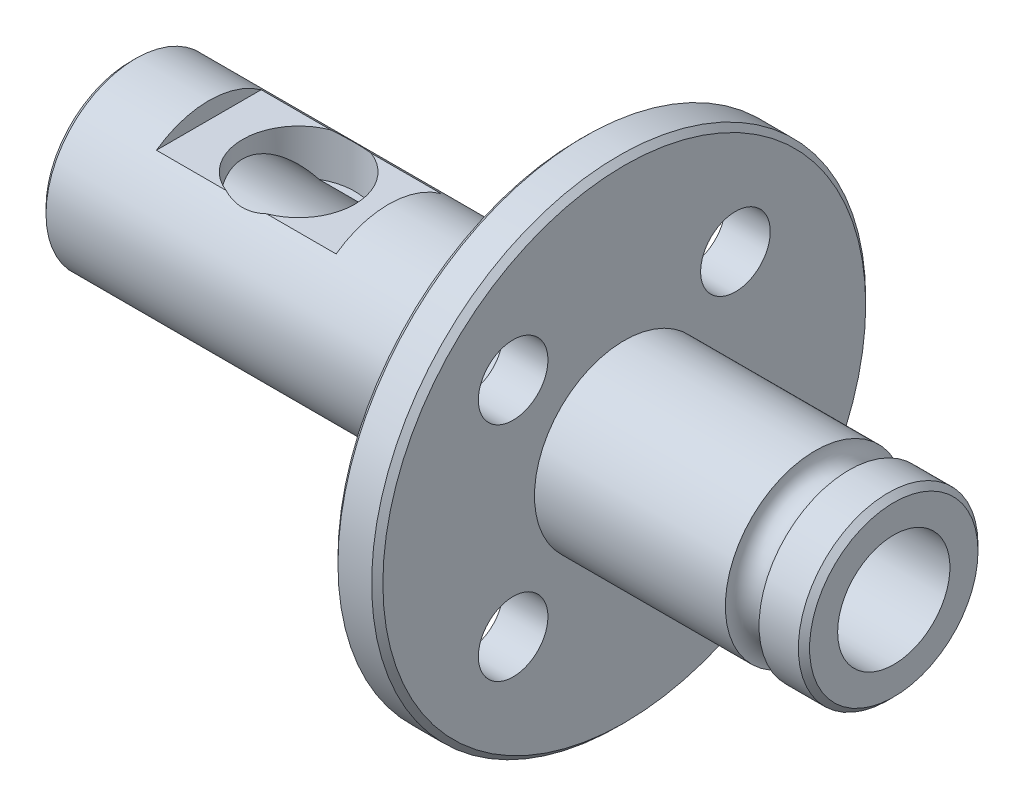
ISO-10303-21;
HEADER;
FILE_DESCRIPTION(('STEP AP214'),'2;1');
FILE_NAME('part.step','',(''),(''),'','','');
FILE_SCHEMA(('AUTOMOTIVE_DESIGN { 1 0 10303 214 1 1 1 1 }'));
ENDSEC;
DATA;
#1=APPLICATION_CONTEXT('core data for automotive mechanical design processes');
#2=APPLICATION_PROTOCOL_DEFINITION('international standard','automotive_design',2000,#1);
#3=PRODUCT_CONTEXT('',#1,'mechanical');
#4=PRODUCT('Part','Part','',(#3));
#5=PRODUCT_RELATED_PRODUCT_CATEGORY('part','',(#4));
#6=PRODUCT_DEFINITION_FORMATION('','',#4);
#7=PRODUCT_DEFINITION_CONTEXT('part definition',#1,'design');
#8=PRODUCT_DEFINITION('design','',#6,#7);
#9=PRODUCT_DEFINITION_SHAPE('','',#8);
#10=(LENGTH_UNIT() NAMED_UNIT(*) SI_UNIT(.MILLI.,.METRE.));
#11=(NAMED_UNIT(*) PLANE_ANGLE_UNIT() SI_UNIT($,.RADIAN.));
#12=(NAMED_UNIT(*) SI_UNIT($,.STERADIAN.) SOLID_ANGLE_UNIT());
#13=UNCERTAINTY_MEASURE_WITH_UNIT(LENGTH_MEASURE(1.E-05),#10,'distance_accuracy_value','');
#14=(GEOMETRIC_REPRESENTATION_CONTEXT(3) GLOBAL_UNCERTAINTY_ASSIGNED_CONTEXT((#13)) GLOBAL_UNIT_ASSIGNED_CONTEXT((#10,
#11,#12)) REPRESENTATION_CONTEXT('',''));
#15=CARTESIAN_POINT('',(0.,0.,0.));
#16=DIRECTION('',(0.,0.,1.));
#17=DIRECTION('',(1.,0.,0.));
#18=AXIS2_PLACEMENT_3D('',#15,#16,#17);
#19=CARTESIAN_POINT('',(34.,0.,0.));
#20=DIRECTION('',(-1.,0.,0.));
#21=DIRECTION('',(0.,0.,1.));
#22=AXIS2_PLACEMENT_3D('',#19,#20,#21);
#23=CYLINDRICAL_SURFACE('',#22,2.5);
#24=CARTESIAN_POINT('',(0.,0.,0.));
#25=DIRECTION('',(-1.,0.,0.));
#26=DIRECTION('',(0.,0.,1.));
#27=AXIS2_PLACEMENT_3D('',#24,#25,#26);
#28=CIRCLE('',#27,2.5);
#29=CARTESIAN_POINT('',(0.,0.,2.5));
#30=VERTEX_POINT('',#29);
#31=EDGE_CURVE('E177',#30,#30,#28,.T.);
#32=ORIENTED_EDGE('',*,*,#31,.T.);
#33=EDGE_LOOP('',(#32));
#34=FACE_BOUND('',#33,.T.);
#35=CARTESIAN_POINT('',(34.,0.,0.));
#36=DIRECTION('',(-1.,0.,0.));
#37=DIRECTION('',(0.,0.,1.));
#38=AXIS2_PLACEMENT_3D('',#35,#36,#37);
#39=CIRCLE('',#38,2.5);
#40=CARTESIAN_POINT('',(34.,0.,2.5));
#41=VERTEX_POINT('',#40);
#42=EDGE_CURVE('E178',#41,#41,#39,.T.);
#43=ORIENTED_EDGE('',*,*,#42,.F.);
#44=EDGE_LOOP('',(#43));
#45=FACE_BOUND('',#44,.T.);
#46=DIRECTION('',(-1.,0.,0.));
#47=VECTOR('',#46,1.);
#48=CARTESIAN_POINT('',(34.,1.25,-2.1650635094611));
#49=LINE('',#48,#47);
#50=CARTESIAN_POINT('',(6.25,1.25,-2.1650635094611));
#51=VERTEX_POINT('',#50);
#52=CARTESIAN_POINT('',(8.75,1.25,-2.1650635094611));
#53=VERTEX_POINT('',#52);
#54=EDGE_CURVE('E90',#51,#53,#49,.F.);
#55=ORIENTED_EDGE('',*,*,#54,.F.);
#56=CARTESIAN_POINT('',(7.5,0.,0.));
#57=DIRECTION('',(-0.707106781186547,-0.707106781186547,0.));
#58=DIRECTION('',(-0.707106781186547,0.707106781186547,0.));
#59=AXIS2_PLACEMENT_3D('',#56,#57,#58);
#60=ELLIPSE('',#59,3.53553390593274,2.5);
#61=CARTESIAN_POINT('',(6.25,1.25,2.1650635094611));
#62=VERTEX_POINT('',#61);
#63=EDGE_CURVE('E104',#51,#62,#60,.F.);
#64=ORIENTED_EDGE('',*,*,#63,.T.);
#65=DIRECTION('',(-1.,0.,0.));
#66=VECTOR('',#65,1.);
#67=CARTESIAN_POINT('',(34.,1.25,2.1650635094611));
#68=LINE('',#67,#66);
#69=CARTESIAN_POINT('',(8.75,1.25,2.1650635094611));
#70=VERTEX_POINT('',#69);
#71=EDGE_CURVE('E98',#70,#62,#68,.T.);
#72=ORIENTED_EDGE('',*,*,#71,.F.);
#73=CARTESIAN_POINT('',(7.5,0.,0.));
#74=DIRECTION('',(-0.707106781186547,0.707106781186547,0.));
#75=DIRECTION('',(-0.707106781186547,-0.707106781186547,0.));
#76=AXIS2_PLACEMENT_3D('',#73,#74,#75);
#77=ELLIPSE('',#76,3.53553390593274,2.5);
#78=EDGE_CURVE('E102',#70,#53,#77,.T.);
#79=ORIENTED_EDGE('',*,*,#78,.T.);
#80=EDGE_LOOP('',(#55,#64,#72,#79));
#81=FACE_BOUND('',#80,.T.);
#82=ADVANCED_FACE('F36',(#34,#45,#81),#23,.F.);
#83=CARTESIAN_POINT('',(0.,3.25,0.));
#84=DIRECTION('',(0.,1.,0.));
#85=DIRECTION('',(0.,0.,1.));
#86=AXIS2_PLACEMENT_3D('',#83,#84,#85);
#87=PLANE('',#86);
#88=CARTESIAN_POINT('',(7.5,3.25,0.));
#89=DIRECTION('',(0.,1.,0.));
#90=DIRECTION('',(0.,0.,1.));
#91=AXIS2_PLACEMENT_3D('',#88,#89,#90);
#92=CIRCLE('',#91,2.5);
#93=CARTESIAN_POINT('',(8.401387818866,3.25,2.3318447632722));
#94=VERTEX_POINT('',#93);
#95=CARTESIAN_POINT('',(8.401387818866,3.25,-2.3318447632722));
#96=VERTEX_POINT('',#95);
#97=EDGE_CURVE('E480',#94,#96,#92,.T.);
#98=ORIENTED_EDGE('',*,*,#97,.F.);
#99=DIRECTION('',(1.,0.,0.));
#100=VECTOR('',#99,1.);
#101=CARTESIAN_POINT('',(34.,3.25,2.3318447632722));
#102=LINE('',#101,#100);
#103=CARTESIAN_POINT('',(11.5,3.25,2.3318447632722));
#104=VERTEX_POINT('',#103);
#105=EDGE_CURVE('E234',#104,#94,#102,.F.);
#106=ORIENTED_EDGE('',*,*,#105,.F.);
#107=DIRECTION('',(0.,0.,-1.));
#108=VECTOR('',#107,1.);
#109=CARTESIAN_POINT('',(11.5,3.25,-2.5));
#110=LINE('',#109,#108);
#111=CARTESIAN_POINT('',(11.5,3.25,-2.3318447632722));
#112=VERTEX_POINT('',#111);
#113=EDGE_CURVE('E185',#104,#112,#110,.T.);
#114=ORIENTED_EDGE('',*,*,#113,.T.);
#115=DIRECTION('',(1.,0.,0.));
#116=VECTOR('',#115,1.);
#117=CARTESIAN_POINT('',(34.,3.25,-2.3318447632722));
#118=LINE('',#117,#116);
#119=EDGE_CURVE('E229',#96,#112,#118,.T.);
#120=ORIENTED_EDGE('',*,*,#119,.F.);
#121=EDGE_LOOP('',(#98,#106,#114,#120));
#122=FACE_BOUND('',#121,.T.);
#123=ADVANCED_FACE('F139',(#122),#87,.T.);
#124=CARTESIAN_POINT('',(34.,4.,0.));
#125=DIRECTION('',(1.,0.,0.));
#126=DIRECTION('',(0.,0.,-1.));
#127=AXIS2_PLACEMENT_3D('',#124,#125,#126);
#128=PLANE('',#127);
#129=CARTESIAN_POINT('',(34.,0.,0.));
#130=DIRECTION('',(1.,0.,0.));
#131=DIRECTION('',(0.,0.,-1.));
#132=AXIS2_PLACEMENT_3D('',#129,#130,#131);
#133=CIRCLE('',#132,3.75000000000001);
#134=CARTESIAN_POINT('',(34.,0.,-3.75000000000001));
#135=VERTEX_POINT('',#134);
#136=EDGE_CURVE('E97',#135,#135,#133,.T.);
#137=ORIENTED_EDGE('',*,*,#136,.T.);
#138=EDGE_LOOP('',(#137));
#139=FACE_BOUND('',#138,.T.);
#140=ORIENTED_EDGE('',*,*,#42,.T.);
#141=EDGE_LOOP('',(#140));
#142=FACE_BOUND('',#141,.T.);
#143=ADVANCED_FACE('F288',(#139,#142),#128,.T.);
#144=CARTESIAN_POINT('',(34.,0.,0.));
#145=DIRECTION('',(1.,0.,0.));
#146=DIRECTION('',(0.,0.,-1.));
#147=AXIS2_PLACEMENT_3D('',#144,#145,#146);
#148=CYLINDRICAL_SURFACE('',#147,4.);
#149=CARTESIAN_POINT('',(33.75,0.,0.));
#150=DIRECTION('',(1.,0.,0.));
#151=DIRECTION('',(0.,0.,-1.));
#152=AXIS2_PLACEMENT_3D('',#149,#150,#151);
#153=CIRCLE('',#152,4.);
#154=CARTESIAN_POINT('',(33.75,0.,-4.));
#155=VERTEX_POINT('',#154);
#156=EDGE_CURVE('E242',#155,#155,#153,.F.);
#157=ORIENTED_EDGE('',*,*,#156,.T.);
#158=EDGE_LOOP('',(#157));
#159=FACE_BOUND('',#158,.T.);
#160=CARTESIAN_POINT('',(32.,0.,0.));
#161=DIRECTION('',(1.,0.,0.));
#162=DIRECTION('',(0.,0.,-1.));
#163=AXIS2_PLACEMENT_3D('',#160,#161,#162);
#164=CIRCLE('',#163,4.);
#165=CARTESIAN_POINT('',(32.,0.,-4.));
#166=VERTEX_POINT('',#165);
#167=EDGE_CURVE('E210',#166,#166,#164,.T.);
#168=ORIENTED_EDGE('',*,*,#167,.T.);
#169=EDGE_LOOP('',(#168));
#170=FACE_BOUND('',#169,.T.);
#171=ADVANCED_FACE('F291',(#159,#170),#148,.T.);
#172=CARTESIAN_POINT('',(31.25,0.,0.));
#173=DIRECTION('',(1.,0.,0.));
#174=DIRECTION('',(0.,0.,-1.));
#175=AXIS2_PLACEMENT_3D('',#172,#173,#174);
#176=TOROIDAL_SURFACE('',#175,4.,0.749999999999999);
#177=CARTESIAN_POINT('',(30.5,0.,0.));
#178=DIRECTION('',(1.,0.,0.));
#179=DIRECTION('',(0.,0.,-1.));
#180=AXIS2_PLACEMENT_3D('',#177,#178,#179);
#181=CIRCLE('',#180,4.);
#182=CARTESIAN_POINT('',(30.5,0.,-4.));
#183=VERTEX_POINT('',#182);
#184=EDGE_CURVE('E207',#183,#183,#181,.T.);
#185=ORIENTED_EDGE('',*,*,#184,.T.);
#186=EDGE_LOOP('',(#185));
#187=FACE_BOUND('',#186,.T.);
#188=ORIENTED_EDGE('',*,*,#167,.F.);
#189=EDGE_LOOP('',(#188));
#190=FACE_BOUND('',#189,.T.);
#191=ADVANCED_FACE('F295',(#187,#190),#176,.F.);
#192=CARTESIAN_POINT('',(34.,0.,0.));
#193=DIRECTION('',(1.,0.,0.));
#194=DIRECTION('',(0.,0.,-1.));
#195=AXIS2_PLACEMENT_3D('',#192,#193,#194);
#196=CYLINDRICAL_SURFACE('',#195,4.);
#197=CARTESIAN_POINT('',(22.,0.,0.));
#198=DIRECTION('',(1.,0.,0.));
#199=DIRECTION('',(0.,0.,-1.));
#200=AXIS2_PLACEMENT_3D('',#197,#198,#199);
#201=CIRCLE('',#200,4.);
#202=CARTESIAN_POINT('',(22.,0.,-4.));
#203=VERTEX_POINT('',#202);
#204=EDGE_CURVE('E203',#203,#203,#201,.T.);
#205=ORIENTED_EDGE('',*,*,#204,.T.);
#206=EDGE_LOOP('',(#205));
#207=FACE_BOUND('',#206,.T.);
#208=ORIENTED_EDGE('',*,*,#184,.F.);
#209=EDGE_LOOP('',(#208));
#210=FACE_BOUND('',#209,.T.);
#211=ADVANCED_FACE('F299',(#207,#210),#196,.T.);
#212=CARTESIAN_POINT('',(22.,11.,0.));
#213=DIRECTION('',(1.,0.,0.));
#214=DIRECTION('',(0.,0.,-1.));
#215=AXIS2_PLACEMENT_3D('',#212,#213,#214);
#216=PLANE('',#215);
#217=CARTESIAN_POINT('',(22.,0.,0.));
#218=DIRECTION('',(1.,0.,0.));
#219=DIRECTION('',(0.,0.,-1.));
#220=AXIS2_PLACEMENT_3D('',#217,#218,#219);
#221=CIRCLE('',#220,10.75);
#222=CARTESIAN_POINT('',(22.,0.,-10.75));
#223=VERTEX_POINT('',#222);
#224=EDGE_CURVE('E245',#223,#223,#221,.T.);
#225=ORIENTED_EDGE('',*,*,#224,.T.);
#226=EDGE_LOOP('',(#225));
#227=FACE_BOUND('',#226,.T.);
#228=CARTESIAN_POINT('',(22.,4.94974746830556,4.94974746830582));
#229=DIRECTION('',(1.,0.,0.));
#230=DIRECTION('',(0.,0.,-1.));
#231=AXIS2_PLACEMENT_3D('',#228,#229,#230);
#232=CIRCLE('',#231,1.5500000000003);
#233=CARTESIAN_POINT('',(22.,4.94974746830556,3.39974746830552));
#234=VERTEX_POINT('',#233);
#235=EDGE_CURVE('E182',#234,#234,#232,.T.);
#236=ORIENTED_EDGE('',*,*,#235,.F.);
#237=EDGE_LOOP('',(#236));
#238=FACE_BOUND('',#237,.T.);
#239=CARTESIAN_POINT('',(22.,-4.9497474683061,4.94974746830556));
#240=DIRECTION('',(1.,0.,0.));
#241=DIRECTION('',(0.,0.,-1.));
#242=AXIS2_PLACEMENT_3D('',#239,#240,#241);
#243=CIRCLE('',#242,1.55000000000021);
#244=CARTESIAN_POINT('',(22.,-4.9497474683061,3.39974746830536));
#245=VERTEX_POINT('',#244);
#246=EDGE_CURVE('E192',#245,#245,#243,.T.);
#247=ORIENTED_EDGE('',*,*,#246,.F.);
#248=EDGE_LOOP('',(#247));
#249=FACE_BOUND('',#248,.T.);
#250=CARTESIAN_POINT('',(22.,-4.94974746830584,-4.9497474683061));
#251=DIRECTION('',(1.,0.,0.));
#252=DIRECTION('',(0.,0.,-1.));
#253=AXIS2_PLACEMENT_3D('',#250,#251,#252);
#254=CIRCLE('',#253,1.54999999999993);
#255=CARTESIAN_POINT('',(22.,-4.94974746830584,-6.49974746830603));
#256=VERTEX_POINT('',#255);
#257=EDGE_CURVE('E188',#256,#256,#254,.T.);
#258=ORIENTED_EDGE('',*,*,#257,.F.);
#259=EDGE_LOOP('',(#258));
#260=FACE_BOUND('',#259,.T.);
#261=CARTESIAN_POINT('',(22.,4.94974746830582,-4.94974746830584));
#262=DIRECTION('',(1.,0.,0.));
#263=DIRECTION('',(0.,0.,-1.));
#264=AXIS2_PLACEMENT_3D('',#261,#262,#263);
#265=CIRCLE('',#264,1.55);
#266=CARTESIAN_POINT('',(22.,4.94974746830582,-6.49974746830584));
#267=VERTEX_POINT('',#266);
#268=EDGE_CURVE('E191',#267,#267,#265,.T.);
#269=ORIENTED_EDGE('',*,*,#268,.F.);
#270=EDGE_LOOP('',(#269));
#271=FACE_BOUND('',#270,.T.);
#272=ORIENTED_EDGE('',*,*,#204,.F.);
#273=EDGE_LOOP('',(#272));
#274=FACE_BOUND('',#273,.T.);
#275=ADVANCED_FACE('F303',(#227,#238,#249,#260,#271,#274),#216,.T.);
#276=CARTESIAN_POINT('',(34.,0.,0.));
#277=DIRECTION('',(1.,0.,0.));
#278=DIRECTION('',(0.,0.,-1.));
#279=AXIS2_PLACEMENT_3D('',#276,#277,#278);
#280=CYLINDRICAL_SURFACE('',#279,11.);
#281=CARTESIAN_POINT('',(21.75,0.,0.));
#282=DIRECTION('',(1.,0.,0.));
#283=DIRECTION('',(0.,0.,-1.));
#284=AXIS2_PLACEMENT_3D('',#281,#282,#283);
#285=CIRCLE('',#284,11.);
#286=CARTESIAN_POINT('',(21.75,0.,-11.));
#287=VERTEX_POINT('',#286);
#288=EDGE_CURVE('E251',#287,#287,#285,.F.);
#289=ORIENTED_EDGE('',*,*,#288,.T.);
#290=EDGE_LOOP('',(#289));
#291=FACE_BOUND('',#290,.T.);
#292=CARTESIAN_POINT('',(20.25,0.,0.));
#293=DIRECTION('',(-1.,0.,0.));
#294=DIRECTION('',(0.,0.,1.));
#295=AXIS2_PLACEMENT_3D('',#292,#293,#294);
#296=CIRCLE('',#295,11.);
#297=CARTESIAN_POINT('',(20.25,0.,11.));
#298=VERTEX_POINT('',#297);
#299=EDGE_CURVE('E248',#298,#298,#296,.F.);
#300=ORIENTED_EDGE('',*,*,#299,.T.);
#301=EDGE_LOOP('',(#300));
#302=FACE_BOUND('',#301,.T.);
#303=ADVANCED_FACE('F307',(#291,#302),#280,.T.);
#304=CARTESIAN_POINT('',(20.,4.,0.));
#305=DIRECTION('',(-1.,0.,0.));
#306=DIRECTION('',(0.,0.,1.));
#307=AXIS2_PLACEMENT_3D('',#304,#305,#306);
#308=PLANE('',#307);
#309=CARTESIAN_POINT('',(20.,0.,0.));
#310=DIRECTION('',(-1.,0.,0.));
#311=DIRECTION('',(0.,0.,1.));
#312=AXIS2_PLACEMENT_3D('',#309,#310,#311);
#313=CIRCLE('',#312,10.75);
#314=CARTESIAN_POINT('',(20.,0.,10.75));
#315=VERTEX_POINT('',#314);
#316=EDGE_CURVE('E254',#315,#315,#313,.T.);
#317=ORIENTED_EDGE('',*,*,#316,.T.);
#318=EDGE_LOOP('',(#317));
#319=FACE_BOUND('',#318,.T.);
#320=CARTESIAN_POINT('',(20.,4.94974746830556,4.94974746830582));
#321=DIRECTION('',(-1.,0.,0.));
#322=DIRECTION('',(0.,0.,1.));
#323=AXIS2_PLACEMENT_3D('',#320,#321,#322);
#324=CIRCLE('',#323,1.5500000000003);
#325=CARTESIAN_POINT('',(20.,4.94974746830556,6.49974746830612));
#326=VERTEX_POINT('',#325);
#327=EDGE_CURVE('E204',#326,#326,#324,.T.);
#328=ORIENTED_EDGE('',*,*,#327,.F.);
#329=EDGE_LOOP('',(#328));
#330=FACE_BOUND('',#329,.T.);
#331=CARTESIAN_POINT('',(20.,-4.9497474683061,4.94974746830556));
#332=DIRECTION('',(-1.,0.,0.));
#333=DIRECTION('',(0.,0.,1.));
#334=AXIS2_PLACEMENT_3D('',#331,#332,#333);
#335=CIRCLE('',#334,1.55000000000021);
#336=CARTESIAN_POINT('',(20.,-4.9497474683061,6.49974746830577));
#337=VERTEX_POINT('',#336);
#338=EDGE_CURVE('E219',#337,#337,#335,.T.);
#339=ORIENTED_EDGE('',*,*,#338,.F.);
#340=EDGE_LOOP('',(#339));
#341=FACE_BOUND('',#340,.T.);
#342=CARTESIAN_POINT('',(20.,-4.94974746830584,-4.9497474683061));
#343=DIRECTION('',(-1.,0.,0.));
#344=DIRECTION('',(0.,0.,1.));
#345=AXIS2_PLACEMENT_3D('',#342,#343,#344);
#346=CIRCLE('',#345,1.54999999999993);
#347=CARTESIAN_POINT('',(20.,-4.94974746830584,-3.39974746830617));
#348=VERTEX_POINT('',#347);
#349=EDGE_CURVE('E216',#348,#348,#346,.T.);
#350=ORIENTED_EDGE('',*,*,#349,.F.);
#351=EDGE_LOOP('',(#350));
#352=FACE_BOUND('',#351,.T.);
#353=CARTESIAN_POINT('',(20.,4.94974746830582,-4.94974746830584));
#354=DIRECTION('',(-1.,0.,0.));
#355=DIRECTION('',(0.,0.,1.));
#356=AXIS2_PLACEMENT_3D('',#353,#354,#355);
#357=CIRCLE('',#356,1.55);
#358=CARTESIAN_POINT('',(20.,4.94974746830582,-3.39974746830584));
#359=VERTEX_POINT('',#358);
#360=EDGE_CURVE('E199',#359,#359,#357,.T.);
#361=ORIENTED_EDGE('',*,*,#360,.F.);
#362=EDGE_LOOP('',(#361));
#363=FACE_BOUND('',#362,.T.);
#364=CARTESIAN_POINT('',(20.,0.,0.));
#365=DIRECTION('',(1.,0.,0.));
#366=DIRECTION('',(0.,0.,-1.));
#367=AXIS2_PLACEMENT_3D('',#364,#365,#366);
#368=CIRCLE('',#367,4.);
#369=CARTESIAN_POINT('',(20.,0.,-4.));
#370=VERTEX_POINT('',#369);
#371=EDGE_CURVE('E200',#370,#370,#368,.T.);
#372=ORIENTED_EDGE('',*,*,#371,.T.);
#373=EDGE_LOOP('',(#372));
#374=FACE_BOUND('',#373,.T.);
#375=ADVANCED_FACE('F171',(#319,#330,#341,#352,#363,#374),#308,.T.);
#376=CARTESIAN_POINT('',(34.,0.,0.));
#377=DIRECTION('',(1.,0.,0.));
#378=DIRECTION('',(0.,0.,-1.));
#379=AXIS2_PLACEMENT_3D('',#376,#377,#378);
#380=CYLINDRICAL_SURFACE('',#379,4.);
#381=CARTESIAN_POINT('',(0.249999999999993,0.,0.));
#382=DIRECTION('',(-1.,0.,0.));
#383=DIRECTION('',(0.,0.,1.));
#384=AXIS2_PLACEMENT_3D('',#381,#382,#383);
#385=CIRCLE('',#384,4.);
#386=CARTESIAN_POINT('',(0.249999999999993,0.,4.));
#387=VERTEX_POINT('',#386);
#388=EDGE_CURVE('E45',#387,#387,#385,.F.);
#389=ORIENTED_EDGE('',*,*,#388,.T.);
#390=EDGE_LOOP('',(#389));
#391=FACE_BOUND('',#390,.T.);
#392=CARTESIAN_POINT('',(6.598612181134,3.25,2.3318447632722));
#393=CARTESIAN_POINT('',(6.65107229883034,3.23545094828911,2.35212058302273));
#394=CARTESIAN_POINT('',(6.70442824310382,3.22182658645101,2.37071160075321));
#395=CARTESIAN_POINT('',(6.81279401949057,3.19678929465881,2.40436642988356));
#396=CARTESIAN_POINT('',(6.86780517068707,3.18537818548835,2.41942733926326));
#397=CARTESIAN_POINT('',(7.03465545068169,3.15510210712078,2.45895458338862));
#398=CARTESIAN_POINT('',(7.14862216037378,3.14010445222921,2.47788667647815));
#399=CARTESIAN_POINT('',(7.37964643909848,3.12268488518486,2.49981057204269));
#400=CARTESIAN_POINT('',(7.49671724063431,3.12033039992166,2.50271691027379));
#401=CARTESIAN_POINT('',(7.72960787339433,3.12876737924364,2.4921581585379));
#402=CARTESIAN_POINT('',(7.84542819747562,3.13955345849471,2.47869977525005));
#403=CARTESIAN_POINT('',(8.03523554008613,3.16713112663541,2.44327392358348));
#404=CARTESIAN_POINT('',(8.1105289800985,3.18080999468614,2.42552215130219));
#405=CARTESIAN_POINT('',(8.25823760046943,3.21243034120725,2.38347754259046));
#406=CARTESIAN_POINT('',(8.33065660239289,3.23036592256852,2.35919374925204));
#407=CARTESIAN_POINT('',(8.401387818866,3.25,2.3318447632722));
#408=B_SPLINE_CURVE_WITH_KNOTS('',3,(#392,#393,#394,#395,#396,#397,#398,#399,#400,#401,#402,
#403,#404,#405,#406,#407),.UNSPECIFIED.,.F.,.F.,(4,2,2,2,2,2,2,4),(0.,0.174209857347443,
0.348562430177186,0.696242801318246,1.04577554754894,1.39516509463678,1.6304226898858,
1.86535625021086),.UNSPECIFIED.);
#409=CARTESIAN_POINT('',(6.598612181134,3.25,2.3318447632722));
#410=VERTEX_POINT('',#409);
#411=EDGE_CURVE('E107',#410,#94,#408,.T.);
#412=ORIENTED_EDGE('',*,*,#411,.F.);
#413=CARTESIAN_POINT('',(3.5,3.25,2.3318447632722));
#414=VERTEX_POINT('',#413);
#415=EDGE_CURVE('E233',#410,#414,#102,.F.);
#416=ORIENTED_EDGE('',*,*,#415,.T.);
#417=CARTESIAN_POINT('',(3.5,0.,0.));
#418=DIRECTION('',(-1.,0.,0.));
#419=DIRECTION('',(0.,0.,1.));
#420=AXIS2_PLACEMENT_3D('',#417,#418,#419);
#421=CIRCLE('',#420,4.);
#422=CARTESIAN_POINT('',(3.5,3.25,-2.3318447632722));
#423=VERTEX_POINT('',#422);
#424=EDGE_CURVE('E213',#423,#414,#421,.F.);
#425=ORIENTED_EDGE('',*,*,#424,.F.);
#426=CARTESIAN_POINT('',(6.598612181134,3.25,-2.3318447632722));
#427=VERTEX_POINT('',#426);
#428=EDGE_CURVE('E230',#423,#427,#118,.T.);
#429=ORIENTED_EDGE('',*,*,#428,.T.);
#430=CARTESIAN_POINT('',(8.401387818866,3.25,-2.3318447632722));
#431=CARTESIAN_POINT('',(8.34892770116966,3.23545094828911,-2.35212058302273));
#432=CARTESIAN_POINT('',(8.29557175689618,3.22182658645101,-2.37071160075321));
#433=CARTESIAN_POINT('',(8.18720598050943,3.19678929465881,-2.40436642988356));
#434=CARTESIAN_POINT('',(8.13219482931292,3.18537818548835,-2.41942733926326));
#435=CARTESIAN_POINT('',(7.96534454931831,3.15510210712078,-2.45895458338862));
#436=CARTESIAN_POINT('',(7.85137783962622,3.14010445222921,-2.47788667647815));
#437=CARTESIAN_POINT('',(7.62035356090152,3.12268488518486,-2.49981057204269));
#438=CARTESIAN_POINT('',(7.50328275936569,3.12033039992166,-2.50271691027379));
#439=CARTESIAN_POINT('',(7.27039212660567,3.12876737924364,-2.4921581585379));
#440=CARTESIAN_POINT('',(7.15457180252438,3.13955345849471,-2.47869977525005));
#441=CARTESIAN_POINT('',(6.96476445991388,3.16713112663541,-2.44327392358348));
#442=CARTESIAN_POINT('',(6.8894710199015,3.18080999468614,-2.42552215130219));
#443=CARTESIAN_POINT('',(6.74176239953057,3.21243034120725,-2.38347754259046));
#444=CARTESIAN_POINT('',(6.66934339760711,3.23036592256852,-2.35919374925204));
#445=CARTESIAN_POINT('',(6.598612181134,3.25,-2.3318447632722));
#446=B_SPLINE_CURVE_WITH_KNOTS('',3,(#430,#431,#432,#433,#434,#435,#436,#437,#438,#439,#440,
#441,#442,#443,#444,#445),.UNSPECIFIED.,.F.,.F.,(4,2,2,2,2,2,2,4),(0.,0.174209857347444,
0.348562430177186,0.696242801318246,1.04577554754894,1.39516509463678,1.6304226898858,
1.86535625021086),.UNSPECIFIED.);
#447=EDGE_CURVE('E59',#96,#427,#446,.T.);
#448=ORIENTED_EDGE('',*,*,#447,.F.);
#449=ORIENTED_EDGE('',*,*,#119,.T.);
#450=CARTESIAN_POINT('',(11.5,0.,0.));
#451=DIRECTION('',(1.,0.,0.));
#452=DIRECTION('',(0.,0.,-1.));
#453=AXIS2_PLACEMENT_3D('',#450,#451,#452);
#454=CIRCLE('',#453,4.);
#455=EDGE_CURVE('E226',#104,#112,#454,.F.);
#456=ORIENTED_EDGE('',*,*,#455,.F.);
#457=ORIENTED_EDGE('',*,*,#105,.T.);
#458=EDGE_LOOP('',(#412,#416,#425,#429,#448,#449,#456,#457));
#459=FACE_BOUND('',#458,.T.);
#460=ORIENTED_EDGE('',*,*,#371,.F.);
#461=EDGE_LOOP('',(#460));
#462=FACE_BOUND('',#461,.T.);
#463=ADVANCED_FACE('F123',(#391,#459,#462),#380,.T.);
#464=CARTESIAN_POINT('',(0.,0.,0.));
#465=DIRECTION('',(-1.,0.,0.));
#466=DIRECTION('',(0.,0.,1.));
#467=AXIS2_PLACEMENT_3D('',#464,#465,#466);
#468=PLANE('',#467);
#469=CARTESIAN_POINT('',(0.,0.,0.));
#470=DIRECTION('',(-1.,0.,0.));
#471=DIRECTION('',(0.,0.,1.));
#472=AXIS2_PLACEMENT_3D('',#469,#470,#471);
#473=CIRCLE('',#472,3.75);
#474=CARTESIAN_POINT('',(0.,0.,3.75));
#475=VERTEX_POINT('',#474);
#476=EDGE_CURVE('E11',#475,#475,#473,.T.);
#477=ORIENTED_EDGE('',*,*,#476,.T.);
#478=EDGE_LOOP('',(#477));
#479=FACE_BOUND('',#478,.T.);
#480=ORIENTED_EDGE('',*,*,#31,.F.);
#481=EDGE_LOOP('',(#480));
#482=FACE_BOUND('',#481,.T.);
#483=ADVANCED_FACE('F164',(#479,#482),#468,.T.);
#484=CARTESIAN_POINT('',(12.,4.94974746830582,-4.94974746830584));
#485=DIRECTION('',(1.,0.,0.));
#486=DIRECTION('',(0.,0.,-1.));
#487=AXIS2_PLACEMENT_3D('',#484,#485,#486);
#488=CYLINDRICAL_SURFACE('',#487,1.55);
#489=ORIENTED_EDGE('',*,*,#360,.T.);
#490=EDGE_LOOP('',(#489));
#491=FACE_BOUND('',#490,.T.);
#492=ORIENTED_EDGE('',*,*,#268,.T.);
#493=EDGE_LOOP('',(#492));
#494=FACE_BOUND('',#493,.T.);
#495=ADVANCED_FACE('F155',(#491,#494),#488,.F.);
#496=CARTESIAN_POINT('',(12.,-4.94974746830584,-4.9497474683061));
#497=DIRECTION('',(1.,0.,0.));
#498=DIRECTION('',(0.,0.,-1.));
#499=AXIS2_PLACEMENT_3D('',#496,#497,#498);
#500=CYLINDRICAL_SURFACE('',#499,1.54999999999993);
#501=ORIENTED_EDGE('',*,*,#349,.T.);
#502=EDGE_LOOP('',(#501));
#503=FACE_BOUND('',#502,.T.);
#504=ORIENTED_EDGE('',*,*,#257,.T.);
#505=EDGE_LOOP('',(#504));
#506=FACE_BOUND('',#505,.T.);
#507=ADVANCED_FACE('F151',(#503,#506),#500,.F.);
#508=CARTESIAN_POINT('',(12.,-4.9497474683061,4.94974746830556));
#509=DIRECTION('',(1.,0.,0.));
#510=DIRECTION('',(0.,0.,-1.));
#511=AXIS2_PLACEMENT_3D('',#508,#509,#510);
#512=CYLINDRICAL_SURFACE('',#511,1.55000000000021);
#513=ORIENTED_EDGE('',*,*,#338,.T.);
#514=EDGE_LOOP('',(#513));
#515=FACE_BOUND('',#514,.T.);
#516=ORIENTED_EDGE('',*,*,#246,.T.);
#517=EDGE_LOOP('',(#516));
#518=FACE_BOUND('',#517,.T.);
#519=ADVANCED_FACE('F154',(#515,#518),#512,.F.);
#520=CARTESIAN_POINT('',(12.,4.94974746830556,4.94974746830582));
#521=DIRECTION('',(1.,0.,0.));
#522=DIRECTION('',(0.,0.,-1.));
#523=AXIS2_PLACEMENT_3D('',#520,#521,#522);
#524=CYLINDRICAL_SURFACE('',#523,1.5500000000003);
#525=ORIENTED_EDGE('',*,*,#327,.T.);
#526=EDGE_LOOP('',(#525));
#527=FACE_BOUND('',#526,.T.);
#528=ORIENTED_EDGE('',*,*,#235,.T.);
#529=EDGE_LOOP('',(#528));
#530=FACE_BOUND('',#529,.T.);
#531=ADVANCED_FACE('F146',(#527,#530),#524,.F.);
#532=CARTESIAN_POINT('',(11.5,3.25,-2.5));
#533=DIRECTION('',(1.,0.,0.));
#534=DIRECTION('',(0.,0.,-1.));
#535=AXIS2_PLACEMENT_3D('',#532,#533,#534);
#536=PLANE('',#535);
#537=ORIENTED_EDGE('',*,*,#113,.F.);
#538=ORIENTED_EDGE('',*,*,#455,.T.);
#539=EDGE_LOOP('',(#537,#538));
#540=FACE_BOUND('',#539,.T.);
#541=ADVANCED_FACE('F142',(#540),#536,.F.);
#542=CARTESIAN_POINT('',(3.5,3.25,-2.5));
#543=DIRECTION('',(-1.,0.,0.));
#544=DIRECTION('',(0.,0.,1.));
#545=AXIS2_PLACEMENT_3D('',#542,#543,#544);
#546=PLANE('',#545);
#547=DIRECTION('',(0.,0.,1.));
#548=VECTOR('',#547,1.);
#549=CARTESIAN_POINT('',(3.5,3.25,-2.5));
#550=LINE('',#549,#548);
#551=EDGE_CURVE('E179',#423,#414,#550,.T.);
#552=ORIENTED_EDGE('',*,*,#551,.F.);
#553=ORIENTED_EDGE('',*,*,#424,.T.);
#554=EDGE_LOOP('',(#552,#553));
#555=FACE_BOUND('',#554,.T.);
#556=ADVANCED_FACE('F137',(#555),#546,.F.);
#557=CARTESIAN_POINT('',(7.5,3.25,0.));
#558=DIRECTION('',(0.,1.,0.));
#559=DIRECTION('',(0.,0.,1.));
#560=AXIS2_PLACEMENT_3D('',#557,#558,#559);
#561=CIRCLE('',#560,2.5);
#562=EDGE_CURVE('E237',#427,#410,#561,.T.);
#563=ORIENTED_EDGE('',*,*,#562,.F.);
#564=ORIENTED_EDGE('',*,*,#428,.F.);
#565=ORIENTED_EDGE('',*,*,#551,.T.);
#566=ORIENTED_EDGE('',*,*,#415,.F.);
#567=EDGE_LOOP('',(#563,#564,#565,#566));
#568=FACE_BOUND('',#567,.T.);
#569=ADVANCED_FACE('F133',(#568),#87,.T.);
#570=CARTESIAN_POINT('',(7.5,1.25,0.));
#571=DIRECTION('',(0.,1.,0.));
#572=DIRECTION('',(0.,0.,1.));
#573=AXIS2_PLACEMENT_3D('',#570,#571,#572);
#574=PLANE('',#573);
#575=ORIENTED_EDGE('',*,*,#54,.T.);
#576=CARTESIAN_POINT('',(7.5,1.25,0.));
#577=DIRECTION('',(0.,1.,0.));
#578=DIRECTION('',(0.,0.,1.));
#579=AXIS2_PLACEMENT_3D('',#576,#577,#578);
#580=CIRCLE('',#579,2.5);
#581=EDGE_CURVE('E93',#53,#51,#580,.T.);
#582=ORIENTED_EDGE('',*,*,#581,.T.);
#583=EDGE_LOOP('',(#575,#582));
#584=FACE_BOUND('',#583,.T.);
#585=ADVANCED_FACE('F92',(#584),#574,.T.);
#586=ORIENTED_EDGE('',*,*,#71,.T.);
#587=EDGE_CURVE('E51',#62,#70,#580,.T.);
#588=ORIENTED_EDGE('',*,*,#587,.T.);
#589=EDGE_LOOP('',(#586,#588));
#590=FACE_BOUND('',#589,.T.);
#591=ADVANCED_FACE('F132',(#590),#574,.T.);
#592=CARTESIAN_POINT('',(7.5,1.25,0.));
#593=DIRECTION('',(0.,1.,0.));
#594=DIRECTION('',(0.,0.,1.));
#595=AXIS2_PLACEMENT_3D('',#592,#593,#594);
#596=CYLINDRICAL_SURFACE('',#595,2.5);
#597=ORIENTED_EDGE('',*,*,#411,.T.);
#598=ORIENTED_EDGE('',*,*,#97,.T.);
#599=ORIENTED_EDGE('',*,*,#447,.T.);
#600=ORIENTED_EDGE('',*,*,#562,.T.);
#601=EDGE_LOOP('',(#597,#598,#599,#600));
#602=FACE_BOUND('',#601,.T.);
#603=ORIENTED_EDGE('',*,*,#587,.F.);
#604=ORIENTED_EDGE('',*,*,#63,.F.);
#605=ORIENTED_EDGE('',*,*,#581,.F.);
#606=ORIENTED_EDGE('',*,*,#78,.F.);
#607=EDGE_LOOP('',(#603,#604,#605,#606));
#608=FACE_BOUND('',#607,.T.);
#609=ADVANCED_FACE('F101',(#602,#608),#596,.F.);
#610=CARTESIAN_POINT('',(34.,0.,0.));
#611=DIRECTION('',(-1.,0.,0.));
#612=DIRECTION('',(0.,0.,1.));
#613=AXIS2_PLACEMENT_3D('',#610,#611,#612);
#614=CONICAL_SURFACE('',#613,3.75000000000001,0.785398163397438);
#615=ORIENTED_EDGE('',*,*,#156,.F.);
#616=EDGE_LOOP('',(#615));
#617=FACE_BOUND('',#616,.T.);
#618=ORIENTED_EDGE('',*,*,#136,.F.);
#619=EDGE_LOOP('',(#618));
#620=FACE_BOUND('',#619,.T.);
#621=ADVANCED_FACE('F131',(#617,#620),#614,.T.);
#622=CARTESIAN_POINT('',(22.,0.,0.));
#623=DIRECTION('',(-1.,0.,0.));
#624=DIRECTION('',(0.,0.,1.));
#625=AXIS2_PLACEMENT_3D('',#622,#623,#624);
#626=CONICAL_SURFACE('',#625,10.75,0.785398163397441);
#627=ORIENTED_EDGE('',*,*,#288,.F.);
#628=EDGE_LOOP('',(#627));
#629=FACE_BOUND('',#628,.T.);
#630=ORIENTED_EDGE('',*,*,#224,.F.);
#631=EDGE_LOOP('',(#630));
#632=FACE_BOUND('',#631,.T.);
#633=ADVANCED_FACE('F266',(#629,#632),#626,.T.);
#634=CARTESIAN_POINT('',(20.25,0.,0.));
#635=DIRECTION('',(1.,0.,0.));
#636=DIRECTION('',(0.,0.,-1.));
#637=AXIS2_PLACEMENT_3D('',#634,#635,#636);
#638=CONICAL_SURFACE('',#637,11.,0.785398163397441);
#639=ORIENTED_EDGE('',*,*,#316,.F.);
#640=EDGE_LOOP('',(#639));
#641=FACE_BOUND('',#640,.T.);
#642=ORIENTED_EDGE('',*,*,#299,.F.);
#643=EDGE_LOOP('',(#642));
#644=FACE_BOUND('',#643,.T.);
#645=ADVANCED_FACE('F261',(#641,#644),#638,.T.);
#646=CARTESIAN_POINT('',(0.249999999999993,0.,0.));
#647=DIRECTION('',(1.,0.,0.));
#648=DIRECTION('',(0.,0.,-1.));
#649=AXIS2_PLACEMENT_3D('',#646,#647,#648);
#650=CONICAL_SURFACE('',#649,4.,0.785398163397455);
#651=ORIENTED_EDGE('',*,*,#476,.F.);
#652=EDGE_LOOP('',(#651));
#653=FACE_BOUND('',#652,.T.);
#654=ORIENTED_EDGE('',*,*,#388,.F.);
#655=EDGE_LOOP('',(#654));
#656=FACE_BOUND('',#655,.T.);
#657=ADVANCED_FACE('F39',(#653,#656),#650,.T.);
#658=CLOSED_SHELL('',(#82,#123,#143,#171,#191,#211,#275,#303,#375,#463,#483,#495,#507,#519,#531,
#541,#556,#569,#585,#591,#609,#621,#633,#645,#657));
#659=MANIFOLD_SOLID_BREP('B2',#658);
#660=ADVANCED_BREP_SHAPE_REPRESENTATION('',(#18,#659),#14);
#661=SHAPE_DEFINITION_REPRESENTATION(#9,#660);
ENDSEC;
END-ISO-10303-21;
